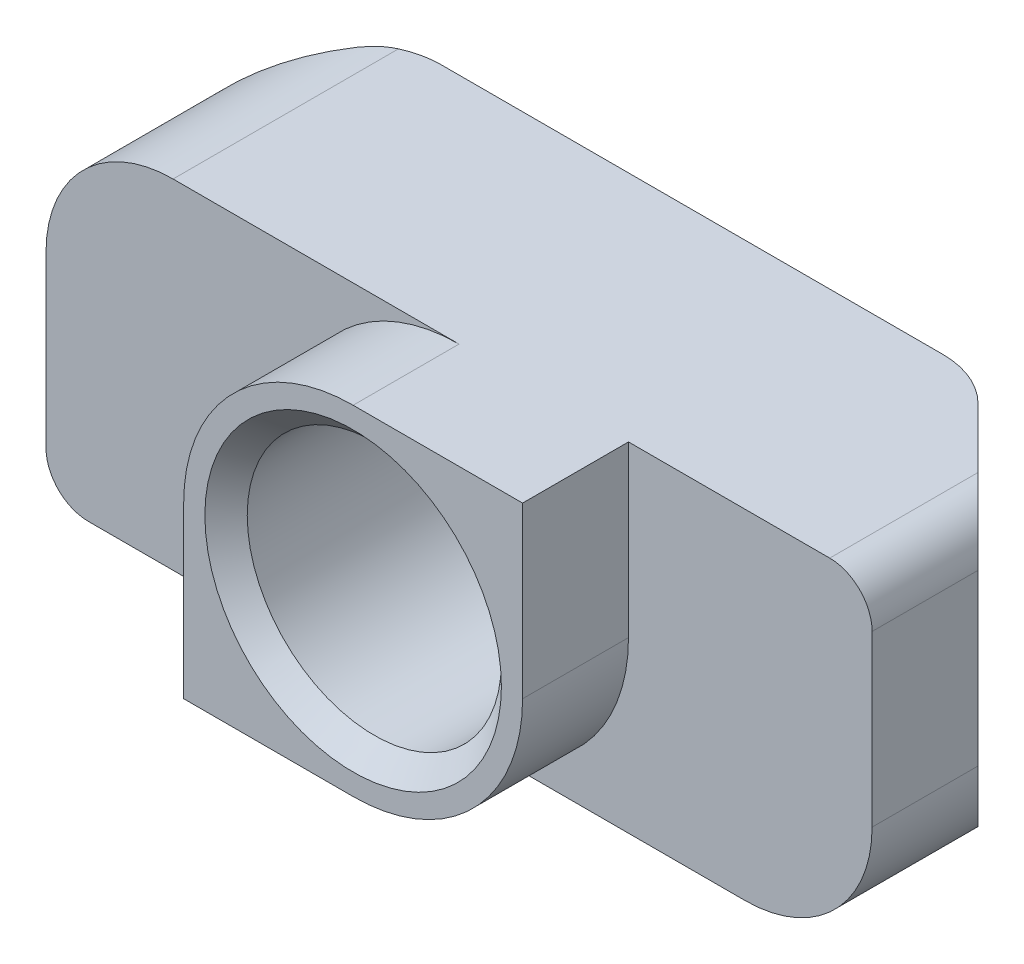
ISO-10303-21;
HEADER;
FILE_DESCRIPTION(('STEP AP214'),'2;1');
FILE_NAME('part.step','',(''),(''),'','','');
FILE_SCHEMA(('AUTOMOTIVE_DESIGN { 1 0 10303 214 1 1 1 1 }'));
ENDSEC;
DATA;
#1=APPLICATION_CONTEXT('core data for automotive mechanical design processes');
#2=APPLICATION_PROTOCOL_DEFINITION('international standard','automotive_design',2000,#1);
#3=PRODUCT_CONTEXT('',#1,'mechanical');
#4=PRODUCT('Part','Part','',(#3));
#5=PRODUCT_RELATED_PRODUCT_CATEGORY('part','',(#4));
#6=PRODUCT_DEFINITION_FORMATION('','',#4);
#7=PRODUCT_DEFINITION_CONTEXT('part definition',#1,'design');
#8=PRODUCT_DEFINITION('design','',#6,#7);
#9=PRODUCT_DEFINITION_SHAPE('','',#8);
#10=(LENGTH_UNIT() NAMED_UNIT(*) SI_UNIT(.MILLI.,.METRE.));
#11=(NAMED_UNIT(*) PLANE_ANGLE_UNIT() SI_UNIT($,.RADIAN.));
#12=(NAMED_UNIT(*) SI_UNIT($,.STERADIAN.) SOLID_ANGLE_UNIT());
#13=UNCERTAINTY_MEASURE_WITH_UNIT(LENGTH_MEASURE(1.E-05),#10,'distance_accuracy_value','');
#14=(GEOMETRIC_REPRESENTATION_CONTEXT(3) GLOBAL_UNCERTAINTY_ASSIGNED_CONTEXT((#13)) GLOBAL_UNIT_ASSIGNED_CONTEXT((#10,
#11,#12)) REPRESENTATION_CONTEXT('',''));
#15=CARTESIAN_POINT('',(0.,0.,0.));
#16=DIRECTION('',(0.,0.,1.));
#17=DIRECTION('',(1.,0.,0.));
#18=AXIS2_PLACEMENT_3D('',#15,#16,#17);
#19=CARTESIAN_POINT('',(-6.74999999991629,-4.,0.));
#20=DIRECTION('',(-0.707106781186547,0.,-0.707106781186548));
#21=DIRECTION('',(-0.707106781186548,0.,0.707106781186547));
#22=AXIS2_PLACEMENT_3D('',#19,#20,#21);
#23=PLANE('',#22);
#24=DIRECTION('',(0.,1.,0.));
#25=VECTOR('',#24,1.);
#26=CARTESIAN_POINT('',(-9.74999999991629,-4.,3.));
#27=LINE('',#26,#25);
#28=CARTESIAN_POINT('',(-9.74999999991629,-3.,3.));
#29=VERTEX_POINT('',#28);
#30=CARTESIAN_POINT('',(-9.74999999991629,1.,3.));
#31=VERTEX_POINT('',#30);
#32=EDGE_CURVE('E217',#29,#31,#27,.T.);
#33=ORIENTED_EDGE('',*,*,#32,.T.);
#34=CARTESIAN_POINT('',(-6.74999999991629,1.,0.));
#35=DIRECTION('',(-0.707106781186547,0.,-0.707106781186548));
#36=DIRECTION('',(0.707106781186548,0.,-0.707106781186547));
#37=AXIS2_PLACEMENT_3D('',#34,#35,#36);
#38=ELLIPSE('',#37,4.24264068711929,3.);
#39=CARTESIAN_POINT('',(-7.33578643754319,3.94225326059678,0.585786437626904));
#40=VERTEX_POINT('',#39);
#41=EDGE_CURVE('E317',#31,#40,#38,.T.);
#42=ORIENTED_EDGE('',*,*,#41,.T.);
#43=DIRECTION('',(0.,1.,0.));
#44=VECTOR('',#43,1.);
#45=CARTESIAN_POINT('',(-7.33578643754319,-4.,0.585786437626904));
#46=LINE('',#45,#44);
#47=CARTESIAN_POINT('',(-7.33578643754319,-4.,0.585786437626904));
#48=VERTEX_POINT('',#47);
#49=EDGE_CURVE('E276',#40,#48,#46,.F.);
#50=ORIENTED_EDGE('',*,*,#49,.T.);
#51=DIRECTION('',(-0.707106781186548,0.,0.707106781186547));
#52=VECTOR('',#51,1.);
#53=CARTESIAN_POINT('',(-6.74999999991629,-4.,0.));
#54=LINE('',#53,#52);
#55=CARTESIAN_POINT('',(-8.74999999991629,-4.,2.));
#56=VERTEX_POINT('',#55);
#57=EDGE_CURVE('E210',#48,#56,#54,.T.);
#58=ORIENTED_EDGE('',*,*,#57,.T.);
#59=CARTESIAN_POINT('',(-8.74999999991629,-3.,2.));
#60=DIRECTION('',(-0.707106781186547,0.,-0.707106781186548));
#61=DIRECTION('',(-0.707106781186548,0.,0.707106781186547));
#62=AXIS2_PLACEMENT_3D('',#59,#60,#61);
#63=ELLIPSE('',#62,1.4142135623731,1.);
#64=EDGE_CURVE('E257',#56,#29,#63,.T.);
#65=ORIENTED_EDGE('',*,*,#64,.T.);
#66=EDGE_LOOP('',(#33,#42,#50,#58,#65));
#67=FACE_BOUND('',#66,.T.);
#68=ADVANCED_FACE('F41',(#67),#23,.T.);
#69=CARTESIAN_POINT('',(6.75000000008371,-4.,0.));
#70=DIRECTION('',(0.,0.,-1.));
#71=DIRECTION('',(-1.,0.,0.));
#72=AXIS2_PLACEMENT_3D('',#69,#70,#71);
#73=PLANE('',#72);
#74=CARTESIAN_POINT('',(0.,0.,0.));
#75=DIRECTION('',(0.,0.,-1.));
#76=DIRECTION('',(-1.,0.,0.));
#77=AXIS2_PLACEMENT_3D('',#74,#75,#76);
#78=CIRCLE('',#77,3.49999999998817);
#79=CARTESIAN_POINT('',(-3.49999999998817,0.,0.));
#80=VERTEX_POINT('',#79);
#81=EDGE_CURVE('E236',#80,#80,#78,.F.);
#82=ORIENTED_EDGE('',*,*,#81,.T.);
#83=EDGE_LOOP('',(#82));
#84=FACE_BOUND('',#83,.T.);
#85=DIRECTION('',(-1.,0.,0.));
#86=VECTOR('',#85,1.);
#87=CARTESIAN_POINT('',(6.75000000008371,4.,0.));
#88=LINE('',#87,#86);
#89=CARTESIAN_POINT('',(5.92157287533752,4.,0.));
#90=VERTEX_POINT('',#89);
#91=CARTESIAN_POINT('',(-5.9215728751701,4.,0.));
#92=VERTEX_POINT('',#91);
#93=EDGE_CURVE('E213',#90,#92,#88,.T.);
#94=ORIENTED_EDGE('',*,*,#93,.F.);
#95=DIRECTION('',(0.,1.,0.));
#96=VECTOR('',#95,1.);
#97=CARTESIAN_POINT('',(5.92157287533752,-4.,0.));
#98=LINE('',#97,#96);
#99=CARTESIAN_POINT('',(5.92157287533752,-4.,0.));
#100=VERTEX_POINT('',#99);
#101=EDGE_CURVE('E269',#90,#100,#98,.F.);
#102=ORIENTED_EDGE('',*,*,#101,.T.);
#103=DIRECTION('',(-1.,0.,0.));
#104=VECTOR('',#103,1.);
#105=CARTESIAN_POINT('',(6.75000000008371,-4.,0.));
#106=LINE('',#105,#104);
#107=CARTESIAN_POINT('',(-5.9215728751701,-4.,0.));
#108=VERTEX_POINT('',#107);
#109=EDGE_CURVE('E215',#100,#108,#106,.T.);
#110=ORIENTED_EDGE('',*,*,#109,.T.);
#111=DIRECTION('',(0.,1.,0.));
#112=VECTOR('',#111,1.);
#113=CARTESIAN_POINT('',(-5.9215728751701,-4.,0.));
#114=LINE('',#113,#112);
#115=EDGE_CURVE('E266',#108,#92,#114,.T.);
#116=ORIENTED_EDGE('',*,*,#115,.T.);
#117=EDGE_LOOP('',(#94,#102,#110,#116));
#118=FACE_BOUND('',#117,.T.);
#119=ADVANCED_FACE('F361',(#84,#118),#73,.T.);
#120=CARTESIAN_POINT('',(9.75000000008371,-4.,3.));
#121=DIRECTION('',(0.707106781186548,0.,-0.707106781186547));
#122=DIRECTION('',(-0.707106781186547,0.,-0.707106781186548));
#123=AXIS2_PLACEMENT_3D('',#120,#121,#122);
#124=PLANE('',#123);
#125=DIRECTION('',(0.,1.,0.));
#126=VECTOR('',#125,1.);
#127=CARTESIAN_POINT('',(9.75000000008371,-4.,3.));
#128=LINE('',#127,#126);
#129=CARTESIAN_POINT('',(9.75000000008371,-1.,3.));
#130=VERTEX_POINT('',#129);
#131=CARTESIAN_POINT('',(9.75000000008371,3.,3.));
#132=VERTEX_POINT('',#131);
#133=EDGE_CURVE('E223',#130,#132,#128,.T.);
#134=ORIENTED_EDGE('',*,*,#133,.F.);
#135=CARTESIAN_POINT('',(6.75000000008371,-1.,0.));
#136=DIRECTION('',(0.707106781186548,0.,-0.707106781186547));
#137=DIRECTION('',(-0.707106781186547,0.,-0.707106781186548));
#138=AXIS2_PLACEMENT_3D('',#135,#136,#137);
#139=ELLIPSE('',#138,4.24264068711928,3.);
#140=CARTESIAN_POINT('',(7.33578643771062,-3.94225326059678,0.585786437626905));
#141=VERTEX_POINT('',#140);
#142=EDGE_CURVE('E281',#130,#141,#139,.T.);
#143=ORIENTED_EDGE('',*,*,#142,.T.);
#144=DIRECTION('',(0.,1.,0.));
#145=VECTOR('',#144,1.);
#146=CARTESIAN_POINT('',(7.33578643771062,-4.,0.585786437626905));
#147=LINE('',#146,#145);
#148=CARTESIAN_POINT('',(7.33578643771062,4.,0.585786437626905));
#149=VERTEX_POINT('',#148);
#150=EDGE_CURVE('E259',#141,#149,#147,.T.);
#151=ORIENTED_EDGE('',*,*,#150,.T.);
#152=DIRECTION('',(-0.707106781186547,0.,-0.707106781186548));
#153=VECTOR('',#152,1.);
#154=CARTESIAN_POINT('',(9.75000000008371,4.,3.));
#155=LINE('',#154,#153);
#156=CARTESIAN_POINT('',(8.75000000008371,4.,2.));
#157=VERTEX_POINT('',#156);
#158=EDGE_CURVE('E175',#157,#149,#155,.T.);
#159=ORIENTED_EDGE('',*,*,#158,.F.);
#160=CARTESIAN_POINT('',(8.75000000008371,3.,2.));
#161=DIRECTION('',(0.707106781186548,0.,-0.707106781186547));
#162=DIRECTION('',(0.707106781186547,0.,0.707106781186548));
#163=AXIS2_PLACEMENT_3D('',#160,#161,#162);
#164=ELLIPSE('',#163,1.41421356237309,1.);
#165=EDGE_CURVE('E242',#157,#132,#164,.T.);
#166=ORIENTED_EDGE('',*,*,#165,.T.);
#167=EDGE_LOOP('',(#134,#143,#151,#159,#166));
#168=FACE_BOUND('',#167,.T.);
#169=ADVANCED_FACE('F354',(#168),#124,.T.);
#170=CARTESIAN_POINT('',(9.75000000008371,-4.,8.));
#171=DIRECTION('',(1.,0.,0.));
#172=DIRECTION('',(0.,0.,-1.));
#173=AXIS2_PLACEMENT_3D('',#170,#171,#172);
#174=PLANE('',#173);
#175=DIRECTION('',(0.,-1.,0.));
#176=VECTOR('',#175,1.);
#177=CARTESIAN_POINT('',(9.75000000008371,4.,5.5));
#178=LINE('',#177,#176);
#179=CARTESIAN_POINT('',(9.75000000008371,3.,5.5));
#180=VERTEX_POINT('',#179);
#181=CARTESIAN_POINT('',(9.75000000008371,-1.,5.5));
#182=VERTEX_POINT('',#181);
#183=EDGE_CURVE('E192',#180,#182,#178,.T.);
#184=ORIENTED_EDGE('',*,*,#183,.T.);
#185=DIRECTION('',(0.,0.,-1.));
#186=VECTOR('',#185,1.);
#187=CARTESIAN_POINT('',(9.75000000008371,-1.,8.));
#188=LINE('',#187,#186);
#189=EDGE_CURVE('E278',#182,#130,#188,.T.);
#190=ORIENTED_EDGE('',*,*,#189,.T.);
#191=ORIENTED_EDGE('',*,*,#133,.T.);
#192=DIRECTION('',(0.,0.,-1.));
#193=VECTOR('',#192,1.);
#194=CARTESIAN_POINT('',(9.75000000008371,3.,5.5));
#195=LINE('',#194,#193);
#196=EDGE_CURVE('E245',#132,#180,#195,.F.);
#197=ORIENTED_EDGE('',*,*,#196,.T.);
#198=EDGE_LOOP('',(#184,#190,#191,#197));
#199=FACE_BOUND('',#198,.T.);
#200=ADVANCED_FACE('F452',(#199),#174,.T.);
#201=CARTESIAN_POINT('',(-9.74999999991629,-4.,8.));
#202=DIRECTION('',(0.,0.,1.));
#203=DIRECTION('',(1.,0.,0.));
#204=AXIS2_PLACEMENT_3D('',#201,#202,#203);
#205=PLANE('',#204);
#206=CARTESIAN_POINT('',(0.,0.,8.));
#207=DIRECTION('',(0.,0.,1.));
#208=DIRECTION('',(1.,0.,0.));
#209=AXIS2_PLACEMENT_3D('',#206,#207,#208);
#210=CIRCLE('',#209,3.49999999998816);
#211=CARTESIAN_POINT('',(3.49999999998815,0.,8.));
#212=VERTEX_POINT('',#211);
#213=EDGE_CURVE('E225',#212,#212,#210,.F.);
#214=ORIENTED_EDGE('',*,*,#213,.T.);
#215=EDGE_LOOP('',(#214));
#216=FACE_BOUND('',#215,.T.);
#217=DIRECTION('',(1.,0.,0.));
#218=VECTOR('',#217,1.);
#219=CARTESIAN_POINT('',(-9.74999999991629,4.,8.));
#220=LINE('',#219,#218);
#221=CARTESIAN_POINT('',(0.,4.,8.));
#222=VERTEX_POINT('',#221);
#223=CARTESIAN_POINT('',(4.00000000008371,4.,8.));
#224=VERTEX_POINT('',#223);
#225=EDGE_CURVE('E166',#222,#224,#220,.T.);
#226=ORIENTED_EDGE('',*,*,#225,.F.);
#227=CARTESIAN_POINT('',(0.,0.,8.));
#228=DIRECTION('',(0.,0.,1.));
#229=DIRECTION('',(1.,0.,0.));
#230=AXIS2_PLACEMENT_3D('',#227,#228,#229);
#231=CIRCLE('',#230,4.);
#232=CARTESIAN_POINT('',(-4.,0.,8.));
#233=VERTEX_POINT('',#232);
#234=EDGE_CURVE('E321',#222,#233,#231,.T.);
#235=ORIENTED_EDGE('',*,*,#234,.T.);
#236=DIRECTION('',(0.,-1.,0.));
#237=VECTOR('',#236,1.);
#238=CARTESIAN_POINT('',(-4.,4.,8.));
#239=LINE('',#238,#237);
#240=CARTESIAN_POINT('',(-4.,-4.,8.));
#241=VERTEX_POINT('',#240);
#242=EDGE_CURVE('E176',#233,#241,#239,.T.);
#243=ORIENTED_EDGE('',*,*,#242,.T.);
#244=DIRECTION('',(1.,0.,0.));
#245=VECTOR('',#244,1.);
#246=CARTESIAN_POINT('',(-9.74999999991629,-4.,8.));
#247=LINE('',#246,#245);
#248=CARTESIAN_POINT('',(8.37125507802128E-11,-4.,8.));
#249=VERTEX_POINT('',#248);
#250=EDGE_CURVE('E212',#241,#249,#247,.T.);
#251=ORIENTED_EDGE('',*,*,#250,.T.);
#252=CARTESIAN_POINT('',(8.37116834184748E-11,0.,8.));
#253=DIRECTION('',(0.,0.,1.));
#254=DIRECTION('',(1.,0.,0.));
#255=AXIS2_PLACEMENT_3D('',#252,#253,#254);
#256=CIRCLE('',#255,4.);
#257=CARTESIAN_POINT('',(4.00000000008371,0.,8.));
#258=VERTEX_POINT('',#257);
#259=EDGE_CURVE('E190',#249,#258,#256,.T.);
#260=ORIENTED_EDGE('',*,*,#259,.T.);
#261=DIRECTION('',(0.,-1.,0.));
#262=VECTOR('',#261,1.);
#263=CARTESIAN_POINT('',(4.00000000008371,4.,8.));
#264=LINE('',#263,#262);
#265=EDGE_CURVE('E182',#224,#258,#264,.T.);
#266=ORIENTED_EDGE('',*,*,#265,.F.);
#267=EDGE_LOOP('',(#226,#235,#243,#251,#260,#266));
#268=FACE_BOUND('',#267,.T.);
#269=ADVANCED_FACE('F187',(#216,#268),#205,.T.);
#270=CARTESIAN_POINT('',(-9.74999999991629,-4.,3.));
#271=DIRECTION('',(-1.,0.,0.));
#272=DIRECTION('',(0.,0.,1.));
#273=AXIS2_PLACEMENT_3D('',#270,#271,#272);
#274=PLANE('',#273);
#275=DIRECTION('',(0.,-1.,0.));
#276=VECTOR('',#275,1.);
#277=CARTESIAN_POINT('',(-9.74999999991629,4.,5.5));
#278=LINE('',#277,#276);
#279=CARTESIAN_POINT('',(-9.74999999991629,1.,5.5));
#280=VERTEX_POINT('',#279);
#281=CARTESIAN_POINT('',(-9.74999999991629,-3.,5.5));
#282=VERTEX_POINT('',#281);
#283=EDGE_CURVE('E199',#280,#282,#278,.T.);
#284=ORIENTED_EDGE('',*,*,#283,.F.);
#285=DIRECTION('',(0.,0.,1.));
#286=VECTOR('',#285,1.);
#287=CARTESIAN_POINT('',(-9.74999999991629,1.,3.));
#288=LINE('',#287,#286);
#289=EDGE_CURVE('E376',#280,#31,#288,.F.);
#290=ORIENTED_EDGE('',*,*,#289,.T.);
#291=ORIENTED_EDGE('',*,*,#32,.F.);
#292=DIRECTION('',(0.,0.,1.));
#293=VECTOR('',#292,1.);
#294=CARTESIAN_POINT('',(-9.74999999991629,-3.,3.));
#295=LINE('',#294,#293);
#296=EDGE_CURVE('E249',#29,#282,#295,.T.);
#297=ORIENTED_EDGE('',*,*,#296,.T.);
#298=EDGE_LOOP('',(#284,#290,#291,#297));
#299=FACE_BOUND('',#298,.T.);
#300=ADVANCED_FACE('F390',(#299),#274,.T.);
#301=CARTESIAN_POINT('',(0.,-4.,0.));
#302=DIRECTION('',(0.,-1.,0.));
#303=DIRECTION('',(0.,0.,-1.));
#304=AXIS2_PLACEMENT_3D('',#301,#302,#303);
#305=PLANE('',#304);
#306=DIRECTION('',(1.,0.,0.));
#307=VECTOR('',#306,1.);
#308=CARTESIAN_POINT('',(4.00000000008371,-4.,5.5));
#309=LINE('',#308,#307);
#310=CARTESIAN_POINT('',(8.37116834184748E-11,-4.,5.5));
#311=VERTEX_POINT('',#310);
#312=CARTESIAN_POINT('',(6.75000000008371,-4.,5.5));
#313=VERTEX_POINT('',#312);
#314=EDGE_CURVE('E56',#311,#313,#309,.T.);
#315=ORIENTED_EDGE('',*,*,#314,.F.);
#316=DIRECTION('',(0.,0.,-1.));
#317=VECTOR('',#316,1.);
#318=CARTESIAN_POINT('',(8.37116834184748E-11,-4.,8.));
#319=LINE('',#318,#317);
#320=EDGE_CURVE('E327',#311,#249,#319,.F.);
#321=ORIENTED_EDGE('',*,*,#320,.T.);
#322=ORIENTED_EDGE('',*,*,#250,.F.);
#323=DIRECTION('',(0.,0.,1.));
#324=VECTOR('',#323,1.);
#325=CARTESIAN_POINT('',(-4.,-4.,5.5));
#326=LINE('',#325,#324);
#327=CARTESIAN_POINT('',(-4.,-4.,5.5));
#328=VERTEX_POINT('',#327);
#329=EDGE_CURVE('E200',#328,#241,#326,.T.);
#330=ORIENTED_EDGE('',*,*,#329,.F.);
#331=DIRECTION('',(1.,0.,0.));
#332=VECTOR('',#331,1.);
#333=CARTESIAN_POINT('',(-9.74999999991629,-4.,5.5));
#334=LINE('',#333,#332);
#335=CARTESIAN_POINT('',(-8.74999999991629,-4.,5.5));
#336=VERTEX_POINT('',#335);
#337=EDGE_CURVE('E201',#336,#328,#334,.T.);
#338=ORIENTED_EDGE('',*,*,#337,.F.);
#339=DIRECTION('',(0.,0.,1.));
#340=VECTOR('',#339,1.);
#341=CARTESIAN_POINT('',(-8.74999999991629,-4.,0.));
#342=LINE('',#341,#340);
#343=EDGE_CURVE('E254',#336,#56,#342,.F.);
#344=ORIENTED_EDGE('',*,*,#343,.T.);
#345=ORIENTED_EDGE('',*,*,#57,.F.);
#346=CARTESIAN_POINT('',(-5.9215728751701,-4.,2.));
#347=DIRECTION('',(0.,-1.,0.));
#348=DIRECTION('',(0.,0.,-1.));
#349=AXIS2_PLACEMENT_3D('',#346,#347,#348);
#350=CIRCLE('',#349,2.);
#351=EDGE_CURVE('E271',#48,#108,#350,.T.);
#352=ORIENTED_EDGE('',*,*,#351,.T.);
#353=ORIENTED_EDGE('',*,*,#109,.F.);
#354=CARTESIAN_POINT('',(5.92157287533752,-4.,2.));
#355=DIRECTION('',(0.,-1.,0.));
#356=DIRECTION('',(0.,0.,-1.));
#357=AXIS2_PLACEMENT_3D('',#354,#355,#356);
#358=CIRCLE('',#357,2.);
#359=CARTESIAN_POINT('',(6.75000000008371,-4.,0.179640557751091));
#360=VERTEX_POINT('',#359);
#361=EDGE_CURVE('E273',#100,#360,#358,.T.);
#362=ORIENTED_EDGE('',*,*,#361,.T.);
#363=DIRECTION('',(0.,0.,-1.));
#364=VECTOR('',#363,1.);
#365=CARTESIAN_POINT('',(6.75000000008371,-4.,0.));
#366=LINE('',#365,#364);
#367=EDGE_CURVE('E291',#360,#313,#366,.F.);
#368=ORIENTED_EDGE('',*,*,#367,.T.);
#369=EDGE_LOOP('',(#315,#321,#322,#330,#338,#344,#345,#352,#353,#362,#368));
#370=FACE_BOUND('',#369,.T.);
#371=ADVANCED_FACE('F342',(#370),#305,.T.);
#372=CARTESIAN_POINT('',(0.,4.,0.));
#373=DIRECTION('',(0.,-1.,0.));
#374=DIRECTION('',(0.,0.,-1.));
#375=AXIS2_PLACEMENT_3D('',#372,#373,#374);
#376=PLANE('',#375);
#377=DIRECTION('',(1.,0.,0.));
#378=VECTOR('',#377,1.);
#379=CARTESIAN_POINT('',(-9.74999999991629,4.,5.5));
#380=LINE('',#379,#378);
#381=CARTESIAN_POINT('',(-6.74999999991629,4.,5.5));
#382=VERTEX_POINT('',#381);
#383=CARTESIAN_POINT('',(0.,4.,5.5));
#384=VERTEX_POINT('',#383);
#385=EDGE_CURVE('E197',#382,#384,#380,.T.);
#386=ORIENTED_EDGE('',*,*,#385,.T.);
#387=DIRECTION('',(0.,0.,1.));
#388=VECTOR('',#387,1.);
#389=CARTESIAN_POINT('',(0.,4.,0.));
#390=LINE('',#389,#388);
#391=EDGE_CURVE('E172',#384,#222,#390,.T.);
#392=ORIENTED_EDGE('',*,*,#391,.T.);
#393=ORIENTED_EDGE('',*,*,#225,.T.);
#394=DIRECTION('',(0.,0.,-1.));
#395=VECTOR('',#394,1.);
#396=CARTESIAN_POINT('',(4.00000000008371,4.,8.));
#397=LINE('',#396,#395);
#398=CARTESIAN_POINT('',(4.00000000008371,4.,5.5));
#399=VERTEX_POINT('',#398);
#400=EDGE_CURVE('E170',#224,#399,#397,.T.);
#401=ORIENTED_EDGE('',*,*,#400,.T.);
#402=DIRECTION('',(1.,0.,0.));
#403=VECTOR('',#402,1.);
#404=CARTESIAN_POINT('',(4.00000000008371,4.,5.5));
#405=LINE('',#404,#403);
#406=CARTESIAN_POINT('',(8.75000000008371,4.,5.5));
#407=VERTEX_POINT('',#406);
#408=EDGE_CURVE('E185',#399,#407,#405,.T.);
#409=ORIENTED_EDGE('',*,*,#408,.T.);
#410=DIRECTION('',(0.,0.,-1.));
#411=VECTOR('',#410,1.);
#412=CARTESIAN_POINT('',(8.75000000008371,4.,3.));
#413=LINE('',#412,#411);
#414=EDGE_CURVE('E239',#407,#157,#413,.T.);
#415=ORIENTED_EDGE('',*,*,#414,.T.);
#416=ORIENTED_EDGE('',*,*,#158,.T.);
#417=CARTESIAN_POINT('',(5.92157287533752,4.,2.));
#418=DIRECTION('',(0.,-1.,0.));
#419=DIRECTION('',(0.,0.,-1.));
#420=AXIS2_PLACEMENT_3D('',#417,#418,#419);
#421=CIRCLE('',#420,2.);
#422=EDGE_CURVE('E264',#149,#90,#421,.F.);
#423=ORIENTED_EDGE('',*,*,#422,.T.);
#424=ORIENTED_EDGE('',*,*,#93,.T.);
#425=CARTESIAN_POINT('',(-5.9215728751701,4.,2.));
#426=DIRECTION('',(0.,-1.,0.));
#427=DIRECTION('',(0.,0.,-1.));
#428=AXIS2_PLACEMENT_3D('',#425,#426,#427);
#429=CIRCLE('',#428,2.);
#430=CARTESIAN_POINT('',(-6.74999999991629,4.,0.17964055775109));
#431=VERTEX_POINT('',#430);
#432=EDGE_CURVE('E261',#92,#431,#429,.F.);
#433=ORIENTED_EDGE('',*,*,#432,.T.);
#434=DIRECTION('',(0.,0.,1.));
#435=VECTOR('',#434,1.);
#436=CARTESIAN_POINT('',(-6.74999999991629,4.,5.5));
#437=LINE('',#436,#435);
#438=EDGE_CURVE('E370',#431,#382,#437,.T.);
#439=ORIENTED_EDGE('',*,*,#438,.T.);
#440=EDGE_LOOP('',(#386,#392,#393,#401,#409,#415,#416,#423,#424,#433,#439));
#441=FACE_BOUND('',#440,.T.);
#442=ADVANCED_FACE('F168',(#441),#376,.F.);
#443=CARTESIAN_POINT('',(-4.,4.,5.5));
#444=DIRECTION('',(1.,0.,0.));
#445=DIRECTION('',(0.,0.,-1.));
#446=AXIS2_PLACEMENT_3D('',#443,#444,#445);
#447=PLANE('',#446);
#448=ORIENTED_EDGE('',*,*,#242,.F.);
#449=DIRECTION('',(0.,0.,1.));
#450=VECTOR('',#449,1.);
#451=CARTESIAN_POINT('',(-4.,0.,5.5));
#452=LINE('',#451,#450);
#453=CARTESIAN_POINT('',(-4.,0.,5.5));
#454=VERTEX_POINT('',#453);
#455=EDGE_CURVE('E323',#233,#454,#452,.F.);
#456=ORIENTED_EDGE('',*,*,#455,.T.);
#457=DIRECTION('',(0.,-1.,0.));
#458=VECTOR('',#457,1.);
#459=CARTESIAN_POINT('',(-4.,4.,5.5));
#460=LINE('',#459,#458);
#461=EDGE_CURVE('E207',#454,#328,#460,.T.);
#462=ORIENTED_EDGE('',*,*,#461,.T.);
#463=ORIENTED_EDGE('',*,*,#329,.T.);
#464=EDGE_LOOP('',(#448,#456,#462,#463));
#465=FACE_BOUND('',#464,.T.);
#466=ADVANCED_FACE('F338',(#465),#447,.F.);
#467=CARTESIAN_POINT('',(-9.74999999991629,4.,5.5));
#468=DIRECTION('',(0.,0.,-1.));
#469=DIRECTION('',(-1.,0.,0.));
#470=AXIS2_PLACEMENT_3D('',#467,#468,#469);
#471=PLANE('',#470);
#472=ORIENTED_EDGE('',*,*,#385,.F.);
#473=CARTESIAN_POINT('',(-6.74999999991629,1.,5.5));
#474=DIRECTION('',(0.,0.,-1.));
#475=DIRECTION('',(-1.,0.,0.));
#476=AXIS2_PLACEMENT_3D('',#473,#474,#475);
#477=CIRCLE('',#476,3.);
#478=EDGE_CURVE('E373',#382,#280,#477,.F.);
#479=ORIENTED_EDGE('',*,*,#478,.T.);
#480=ORIENTED_EDGE('',*,*,#283,.T.);
#481=CARTESIAN_POINT('',(-8.74999999991629,-3.,5.5));
#482=DIRECTION('',(0.,0.,-1.));
#483=DIRECTION('',(-1.,0.,0.));
#484=AXIS2_PLACEMENT_3D('',#481,#482,#483);
#485=CIRCLE('',#484,1.);
#486=EDGE_CURVE('E252',#282,#336,#485,.F.);
#487=ORIENTED_EDGE('',*,*,#486,.T.);
#488=ORIENTED_EDGE('',*,*,#337,.T.);
#489=ORIENTED_EDGE('',*,*,#461,.F.);
#490=CARTESIAN_POINT('',(0.,0.,5.5));
#491=DIRECTION('',(0.,0.,-1.));
#492=DIRECTION('',(-1.,0.,0.));
#493=AXIS2_PLACEMENT_3D('',#490,#491,#492);
#494=CIRCLE('',#493,4.);
#495=EDGE_CURVE('E49',#454,#384,#494,.T.);
#496=ORIENTED_EDGE('',*,*,#495,.T.);
#497=EDGE_LOOP('',(#472,#479,#480,#487,#488,#489,#496));
#498=FACE_BOUND('',#497,.T.);
#499=ADVANCED_FACE('F333',(#498),#471,.F.);
#500=CARTESIAN_POINT('',(4.00000000008371,4.,5.5));
#501=DIRECTION('',(0.,0.,-1.));
#502=DIRECTION('',(-1.,0.,0.));
#503=AXIS2_PLACEMENT_3D('',#500,#501,#502);
#504=PLANE('',#503);
#505=ORIENTED_EDGE('',*,*,#314,.T.);
#506=CARTESIAN_POINT('',(6.75000000008371,-1.,5.5));
#507=DIRECTION('',(0.,0.,-1.));
#508=DIRECTION('',(-1.,0.,0.));
#509=AXIS2_PLACEMENT_3D('',#506,#507,#508);
#510=CIRCLE('',#509,3.);
#511=EDGE_CURVE('E369',#313,#182,#510,.F.);
#512=ORIENTED_EDGE('',*,*,#511,.T.);
#513=ORIENTED_EDGE('',*,*,#183,.F.);
#514=CARTESIAN_POINT('',(8.75000000008371,3.,5.5));
#515=DIRECTION('',(0.,0.,-1.));
#516=DIRECTION('',(-1.,0.,0.));
#517=AXIS2_PLACEMENT_3D('',#514,#515,#516);
#518=CIRCLE('',#517,1.);
#519=EDGE_CURVE('E247',#180,#407,#518,.F.);
#520=ORIENTED_EDGE('',*,*,#519,.T.);
#521=ORIENTED_EDGE('',*,*,#408,.F.);
#522=DIRECTION('',(0.,-1.,0.));
#523=VECTOR('',#522,1.);
#524=CARTESIAN_POINT('',(4.00000000008371,4.,5.5));
#525=LINE('',#524,#523);
#526=CARTESIAN_POINT('',(4.00000000008371,0.,5.5));
#527=VERTEX_POINT('',#526);
#528=EDGE_CURVE('E184',#399,#527,#525,.T.);
#529=ORIENTED_EDGE('',*,*,#528,.T.);
#530=CARTESIAN_POINT('',(8.37116834184748E-11,0.,5.5));
#531=DIRECTION('',(0.,0.,-1.));
#532=DIRECTION('',(-1.,0.,0.));
#533=AXIS2_PLACEMENT_3D('',#530,#531,#532);
#534=CIRCLE('',#533,4.);
#535=EDGE_CURVE('E11',#527,#311,#534,.T.);
#536=ORIENTED_EDGE('',*,*,#535,.T.);
#537=EDGE_LOOP('',(#505,#512,#513,#520,#521,#529,#536));
#538=FACE_BOUND('',#537,.T.);
#539=ADVANCED_FACE('F344',(#538),#504,.F.);
#540=CARTESIAN_POINT('',(4.00000000008371,4.,8.));
#541=DIRECTION('',(-1.,0.,0.));
#542=DIRECTION('',(0.,0.,1.));
#543=AXIS2_PLACEMENT_3D('',#540,#541,#542);
#544=PLANE('',#543);
#545=ORIENTED_EDGE('',*,*,#265,.T.);
#546=DIRECTION('',(0.,0.,-1.));
#547=VECTOR('',#546,1.);
#548=CARTESIAN_POINT('',(4.00000000008371,0.,5.5));
#549=LINE('',#548,#547);
#550=EDGE_CURVE('E325',#258,#527,#549,.T.);
#551=ORIENTED_EDGE('',*,*,#550,.T.);
#552=ORIENTED_EDGE('',*,*,#528,.F.);
#553=ORIENTED_EDGE('',*,*,#400,.F.);
#554=EDGE_LOOP('',(#545,#551,#552,#553));
#555=FACE_BOUND('',#554,.T.);
#556=ADVANCED_FACE('F181',(#555),#544,.F.);
#557=CARTESIAN_POINT('',(0.,0.,0.));
#558=DIRECTION('',(0.,0.,-1.));
#559=DIRECTION('',(-1.,0.,0.));
#560=AXIS2_PLACEMENT_3D('',#557,#558,#559);
#561=CYLINDRICAL_SURFACE('',#560,2.99999999999999);
#562=CARTESIAN_POINT('',(0.,0.,7.50000000001183));
#563=DIRECTION('',(0.,0.,1.));
#564=DIRECTION('',(1.,0.,0.));
#565=AXIS2_PLACEMENT_3D('',#562,#563,#564);
#566=CIRCLE('',#565,2.99999999999999);
#567=CARTESIAN_POINT('',(2.99999999999999,0.,7.50000000001183));
#568=VERTEX_POINT('',#567);
#569=EDGE_CURVE('E233',#568,#568,#566,.T.);
#570=ORIENTED_EDGE('',*,*,#569,.T.);
#571=EDGE_LOOP('',(#570));
#572=FACE_BOUND('',#571,.T.);
#573=CARTESIAN_POINT('',(0.,0.,0.499999999988177));
#574=DIRECTION('',(0.,0.,-1.));
#575=DIRECTION('',(-1.,0.,0.));
#576=AXIS2_PLACEMENT_3D('',#573,#574,#575);
#577=CIRCLE('',#576,2.99999999999999);
#578=CARTESIAN_POINT('',(-2.99999999999999,0.,0.499999999988177));
#579=VERTEX_POINT('',#578);
#580=EDGE_CURVE('E230',#579,#579,#577,.T.);
#581=ORIENTED_EDGE('',*,*,#580,.T.);
#582=EDGE_LOOP('',(#581));
#583=FACE_BOUND('',#582,.T.);
#584=ADVANCED_FACE('F420',(#572,#583),#561,.F.);
#585=CARTESIAN_POINT('',(0.,0.,8.));
#586=DIRECTION('',(0.,0.,1.));
#587=DIRECTION('',(1.,0.,0.));
#588=AXIS2_PLACEMENT_3D('',#585,#586,#587);
#589=CONICAL_SURFACE('',#588,3.49999999998816,0.785398163397446);
#590=ORIENTED_EDGE('',*,*,#569,.F.);
#591=EDGE_LOOP('',(#590));
#592=FACE_BOUND('',#591,.T.);
#593=ORIENTED_EDGE('',*,*,#213,.F.);
#594=EDGE_LOOP('',(#593));
#595=FACE_BOUND('',#594,.T.);
#596=ADVANCED_FACE('F414',(#592,#595),#589,.F.);
#597=CARTESIAN_POINT('',(0.,0.,0.499999999988177));
#598=DIRECTION('',(0.,0.,-1.));
#599=DIRECTION('',(-1.,0.,0.));
#600=AXIS2_PLACEMENT_3D('',#597,#598,#599);
#601=CONICAL_SURFACE('',#600,2.99999999999999,0.785398163397451);
#602=ORIENTED_EDGE('',*,*,#81,.F.);
#603=EDGE_LOOP('',(#602));
#604=FACE_BOUND('',#603,.T.);
#605=ORIENTED_EDGE('',*,*,#580,.F.);
#606=EDGE_LOOP('',(#605));
#607=FACE_BOUND('',#606,.T.);
#608=ADVANCED_FACE('F401',(#604,#607),#601,.F.);
#609=CARTESIAN_POINT('',(8.75000000008371,3.,0.));
#610=DIRECTION('',(0.,0.,1.));
#611=DIRECTION('',(1.,0.,0.));
#612=AXIS2_PLACEMENT_3D('',#609,#610,#611);
#613=CYLINDRICAL_SURFACE('',#612,1.);
#614=ORIENTED_EDGE('',*,*,#519,.F.);
#615=ORIENTED_EDGE('',*,*,#196,.F.);
#616=ORIENTED_EDGE('',*,*,#165,.F.);
#617=ORIENTED_EDGE('',*,*,#414,.F.);
#618=EDGE_LOOP('',(#614,#615,#616,#617));
#619=FACE_BOUND('',#618,.T.);
#620=ADVANCED_FACE('F350',(#619),#613,.T.);
#621=CARTESIAN_POINT('',(-8.74999999991629,-3.,3.));
#622=DIRECTION('',(0.,0.,1.));
#623=DIRECTION('',(1.,0.,0.));
#624=AXIS2_PLACEMENT_3D('',#621,#622,#623);
#625=CYLINDRICAL_SURFACE('',#624,1.);
#626=ORIENTED_EDGE('',*,*,#64,.F.);
#627=ORIENTED_EDGE('',*,*,#343,.F.);
#628=ORIENTED_EDGE('',*,*,#486,.F.);
#629=ORIENTED_EDGE('',*,*,#296,.F.);
#630=EDGE_LOOP('',(#626,#627,#628,#629));
#631=FACE_BOUND('',#630,.T.);
#632=ADVANCED_FACE('F394',(#631),#625,.T.);
#633=CARTESIAN_POINT('',(5.92157287533752,-4.,2.));
#634=DIRECTION('',(0.,1.,0.));
#635=DIRECTION('',(0.,0.,1.));
#636=AXIS2_PLACEMENT_3D('',#633,#634,#635);
#637=CYLINDRICAL_SURFACE('',#636,2.);
#638=ORIENTED_EDGE('',*,*,#150,.F.);
#639=CARTESIAN_POINT('',(7.33578643771062,-3.94225326059678,0.585786437626905));
#640=CARTESIAN_POINT('',(7.29362263151619,-3.95065218175971,0.5436139215145));
#641=CARTESIAN_POINT('',(7.24949677160616,-3.95849051638954,0.503269511533735));
#642=CARTESIAN_POINT('',(7.15808080363392,-3.97247089168577,0.426927594114019));
#643=CARTESIAN_POINT('',(7.11082325382297,-3.97862776240852,0.390893771105971));
#644=CARTESIAN_POINT('',(7.01311360155659,-3.98884262289005,0.323076415301191));
#645=CARTESIAN_POINT('',(6.96266099018044,-3.99290027732964,0.291293562135738));
#646=CARTESIAN_POINT('',(6.85854273768402,-3.9984959459694,0.232028830070312));
#647=CARTESIAN_POINT('',(6.8048517812931,-4.00001040684229,0.204589265223644));
#648=CARTESIAN_POINT('',(6.75000000008371,-4.,0.179640557751091));
#649=B_SPLINE_CURVE_WITH_KNOTS('',3,(#639,#640,#641,#642,#643,#644,#645,#646,#647,#648),
.UNSPECIFIED.,.F.,.F.,(4,2,2,2,4),(0.,0.180631081656941,0.359613435123769,0.538624369591325,
0.719284219274026),.UNSPECIFIED.);
#650=EDGE_CURVE('E283',#141,#360,#649,.T.);
#651=ORIENTED_EDGE('',*,*,#650,.T.);
#652=ORIENTED_EDGE('',*,*,#361,.F.);
#653=ORIENTED_EDGE('',*,*,#101,.F.);
#654=ORIENTED_EDGE('',*,*,#422,.F.);
#655=EDGE_LOOP('',(#638,#651,#652,#653,#654));
#656=FACE_BOUND('',#655,.T.);
#657=ADVANCED_FACE('F293',(#656),#637,.T.);
#658=CARTESIAN_POINT('',(-5.9215728751701,-4.,2.));
#659=DIRECTION('',(0.,1.,0.));
#660=DIRECTION('',(0.,0.,1.));
#661=AXIS2_PLACEMENT_3D('',#658,#659,#660);
#662=CYLINDRICAL_SURFACE('',#661,2.);
#663=ORIENTED_EDGE('',*,*,#49,.F.);
#664=CARTESIAN_POINT('',(-7.33578643754319,3.94225326059678,0.585786437626904));
#665=CARTESIAN_POINT('',(-7.29362263134876,3.95065218175971,0.543613921514499));
#666=CARTESIAN_POINT('',(-7.24949677143874,3.95849051638954,0.503269511533734));
#667=CARTESIAN_POINT('',(-7.1580808034665,3.97247089168577,0.426927594114018));
#668=CARTESIAN_POINT('',(-7.11082325365554,3.97862776240852,0.39089377110597));
#669=CARTESIAN_POINT('',(-7.01311360138916,3.98884262289005,0.32307641530119));
#670=CARTESIAN_POINT('',(-6.96266099001302,3.99290027732964,0.291293562135737));
#671=CARTESIAN_POINT('',(-6.85854273751659,3.9984959459694,0.232028830070311));
#672=CARTESIAN_POINT('',(-6.80485178112567,4.00001040684229,0.204589265223642));
#673=CARTESIAN_POINT('',(-6.74999999991629,4.,0.17964055775109));
#674=B_SPLINE_CURVE_WITH_KNOTS('',3,(#664,#665,#666,#667,#668,#669,#670,#671,#672,#673),
.UNSPECIFIED.,.F.,.F.,(4,2,2,2,4),(0.,0.180631081656941,0.359613435123768,0.538624369591325,
0.719284219274027),.UNSPECIFIED.);
#675=EDGE_CURVE('E310',#40,#431,#674,.T.);
#676=ORIENTED_EDGE('',*,*,#675,.T.);
#677=ORIENTED_EDGE('',*,*,#432,.F.);
#678=ORIENTED_EDGE('',*,*,#115,.F.);
#679=ORIENTED_EDGE('',*,*,#351,.F.);
#680=EDGE_LOOP('',(#663,#676,#677,#678,#679));
#681=FACE_BOUND('',#680,.T.);
#682=ADVANCED_FACE('F302',(#681),#662,.T.);
#683=CARTESIAN_POINT('',(6.75000000008371,-1.,8.));
#684=DIRECTION('',(0.,0.,-1.));
#685=DIRECTION('',(-1.,0.,0.));
#686=AXIS2_PLACEMENT_3D('',#683,#684,#685);
#687=CYLINDRICAL_SURFACE('',#686,3.);
#688=ORIENTED_EDGE('',*,*,#511,.F.);
#689=ORIENTED_EDGE('',*,*,#367,.F.);
#690=ORIENTED_EDGE('',*,*,#650,.F.);
#691=ORIENTED_EDGE('',*,*,#142,.F.);
#692=ORIENTED_EDGE('',*,*,#189,.F.);
#693=EDGE_LOOP('',(#688,#689,#690,#691,#692));
#694=FACE_BOUND('',#693,.T.);
#695=ADVANCED_FACE('F297',(#694),#687,.T.);
#696=CARTESIAN_POINT('',(-6.74999999991629,1.,0.));
#697=DIRECTION('',(0.,0.,-1.));
#698=DIRECTION('',(-1.,0.,0.));
#699=AXIS2_PLACEMENT_3D('',#696,#697,#698);
#700=CYLINDRICAL_SURFACE('',#699,3.);
#701=ORIENTED_EDGE('',*,*,#41,.F.);
#702=ORIENTED_EDGE('',*,*,#289,.F.);
#703=ORIENTED_EDGE('',*,*,#478,.F.);
#704=ORIENTED_EDGE('',*,*,#438,.F.);
#705=ORIENTED_EDGE('',*,*,#675,.F.);
#706=EDGE_LOOP('',(#701,#702,#703,#704,#705));
#707=FACE_BOUND('',#706,.T.);
#708=ADVANCED_FACE('F301',(#707),#700,.T.);
#709=CARTESIAN_POINT('',(0.,0.,0.));
#710=DIRECTION('',(0.,0.,1.));
#711=DIRECTION('',(1.,0.,0.));
#712=AXIS2_PLACEMENT_3D('',#709,#710,#711);
#713=CYLINDRICAL_SURFACE('',#712,4.);
#714=ORIENTED_EDGE('',*,*,#495,.F.);
#715=ORIENTED_EDGE('',*,*,#455,.F.);
#716=ORIENTED_EDGE('',*,*,#234,.F.);
#717=ORIENTED_EDGE('',*,*,#391,.F.);
#718=EDGE_LOOP('',(#714,#715,#716,#717));
#719=FACE_BOUND('',#718,.T.);
#720=ADVANCED_FACE('F307',(#719),#713,.T.);
#721=CARTESIAN_POINT('',(8.37116834184748E-11,0.,8.));
#722=DIRECTION('',(0.,0.,1.));
#723=DIRECTION('',(1.,0.,0.));
#724=AXIS2_PLACEMENT_3D('',#721,#722,#723);
#725=CYLINDRICAL_SURFACE('',#724,4.);
#726=ORIENTED_EDGE('',*,*,#259,.F.);
#727=ORIENTED_EDGE('',*,*,#320,.F.);
#728=ORIENTED_EDGE('',*,*,#535,.F.);
#729=ORIENTED_EDGE('',*,*,#550,.F.);
#730=EDGE_LOOP('',(#726,#727,#728,#729));
#731=FACE_BOUND('',#730,.T.);
#732=ADVANCED_FACE('F43',(#731),#725,.T.);
#733=CLOSED_SHELL('',(#68,#119,#169,#200,#269,#300,#371,#442,#466,#499,#539,#556,#584,#596,#608,
#620,#632,#657,#682,#695,#708,#720,#732));
#734=MANIFOLD_SOLID_BREP('B2',#733);
#735=ADVANCED_BREP_SHAPE_REPRESENTATION('',(#18,#734),#14);
#736=SHAPE_DEFINITION_REPRESENTATION(#9,#735);
ENDSEC;
END-ISO-10303-21;
